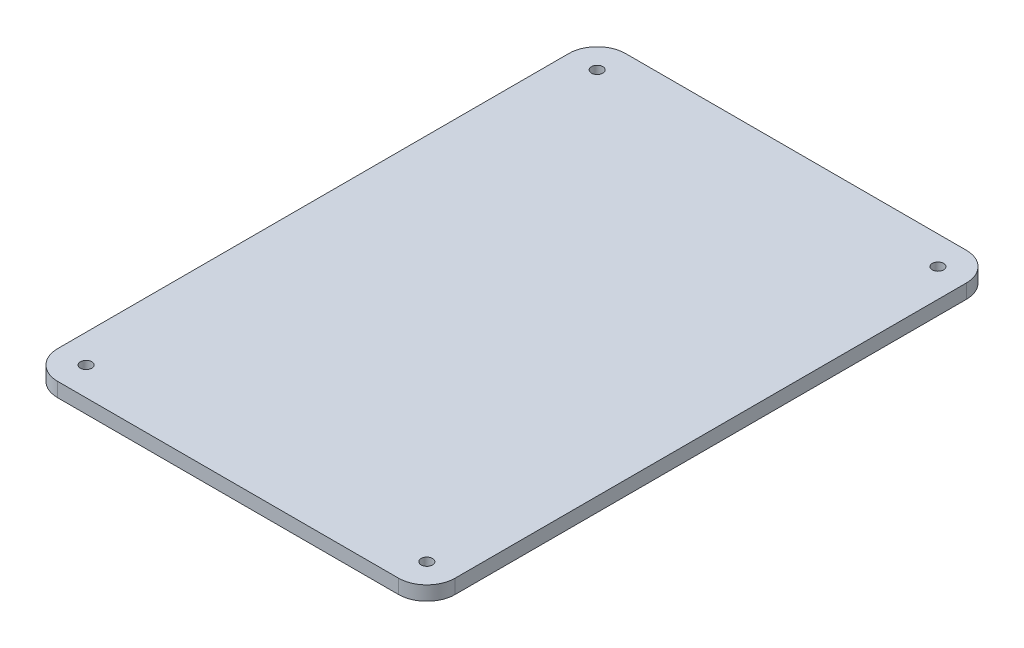
ISO-10303-21;
HEADER;
FILE_DESCRIPTION(('STEP AP214'),'2;1');
FILE_NAME('part.step','',(''),(''),'','','');
FILE_SCHEMA(('AUTOMOTIVE_DESIGN { 1 0 10303 214 1 1 1 1 }'));
ENDSEC;
DATA;
#1=APPLICATION_CONTEXT('core data for automotive mechanical design processes');
#2=APPLICATION_PROTOCOL_DEFINITION('international standard','automotive_design',2000,#1);
#3=PRODUCT_CONTEXT('',#1,'mechanical');
#4=PRODUCT('Part','Part','',(#3));
#5=PRODUCT_RELATED_PRODUCT_CATEGORY('part','',(#4));
#6=PRODUCT_DEFINITION_FORMATION('','',#4);
#7=PRODUCT_DEFINITION_CONTEXT('part definition',#1,'design');
#8=PRODUCT_DEFINITION('design','',#6,#7);
#9=PRODUCT_DEFINITION_SHAPE('','',#8);
#10=(LENGTH_UNIT() NAMED_UNIT(*) SI_UNIT(.MILLI.,.METRE.));
#11=(NAMED_UNIT(*) PLANE_ANGLE_UNIT() SI_UNIT($,.RADIAN.));
#12=(NAMED_UNIT(*) SI_UNIT($,.STERADIAN.) SOLID_ANGLE_UNIT());
#13=UNCERTAINTY_MEASURE_WITH_UNIT(LENGTH_MEASURE(1.E-05),#10,'distance_accuracy_value','');
#14=(GEOMETRIC_REPRESENTATION_CONTEXT(3) GLOBAL_UNCERTAINTY_ASSIGNED_CONTEXT((#13)) GLOBAL_UNIT_ASSIGNED_CONTEXT((#10,
#11,#12)) REPRESENTATION_CONTEXT('',''));
#15=CARTESIAN_POINT('',(0.,0.,0.));
#16=DIRECTION('',(0.,0.,1.));
#17=DIRECTION('',(1.,0.,0.));
#18=AXIS2_PLACEMENT_3D('',#15,#16,#17);
#19=CARTESIAN_POINT('',(0.,5.,0.));
#20=DIRECTION('',(0.,1.,0.));
#21=DIRECTION('',(0.,0.,1.));
#22=AXIS2_PLACEMENT_3D('',#19,#20,#21);
#23=PLANE('',#22);
#24=CARTESIAN_POINT('',(60.,5.,-90.));
#25=DIRECTION('',(0.,1.,0.));
#26=DIRECTION('',(0.,0.,1.));
#27=AXIS2_PLACEMENT_3D('',#24,#25,#26);
#28=CIRCLE('',#27,2.);
#29=CARTESIAN_POINT('',(60.,5.,-88.));
#30=VERTEX_POINT('',#29);
#31=EDGE_CURVE('E149',#30,#30,#28,.T.);
#32=ORIENTED_EDGE('',*,*,#31,.F.);
#33=EDGE_LOOP('',(#32));
#34=FACE_BOUND('',#33,.T.);
#35=CARTESIAN_POINT('',(-60.,5.,90.));
#36=DIRECTION('',(0.,1.,0.));
#37=DIRECTION('',(0.,0.,1.));
#38=AXIS2_PLACEMENT_3D('',#35,#36,#37);
#39=CIRCLE('',#38,2.);
#40=CARTESIAN_POINT('',(-60.,5.,92.));
#41=VERTEX_POINT('',#40);
#42=EDGE_CURVE('E154',#41,#41,#39,.T.);
#43=ORIENTED_EDGE('',*,*,#42,.F.);
#44=EDGE_LOOP('',(#43));
#45=FACE_BOUND('',#44,.T.);
#46=CARTESIAN_POINT('',(60.,5.,90.));
#47=DIRECTION('',(0.,1.,0.));
#48=DIRECTION('',(0.,0.,1.));
#49=AXIS2_PLACEMENT_3D('',#46,#47,#48);
#50=CIRCLE('',#49,2.);
#51=CARTESIAN_POINT('',(60.,5.,92.));
#52=VERTEX_POINT('',#51);
#53=EDGE_CURVE('E184',#52,#52,#50,.T.);
#54=ORIENTED_EDGE('',*,*,#53,.F.);
#55=EDGE_LOOP('',(#54));
#56=FACE_BOUND('',#55,.T.);
#57=CARTESIAN_POINT('',(-60.,5.,-90.));
#58=DIRECTION('',(0.,1.,0.));
#59=DIRECTION('',(0.,0.,1.));
#60=AXIS2_PLACEMENT_3D('',#57,#58,#59);
#61=CIRCLE('',#60,2.);
#62=CARTESIAN_POINT('',(-60.,5.,-88.));
#63=VERTEX_POINT('',#62);
#64=EDGE_CURVE('E187',#63,#63,#61,.T.);
#65=ORIENTED_EDGE('',*,*,#64,.F.);
#66=EDGE_LOOP('',(#65));
#67=FACE_BOUND('',#66,.T.);
#68=DIRECTION('',(0.,0.,1.));
#69=VECTOR('',#68,1.);
#70=CARTESIAN_POINT('',(-70.,5.,-92.5));
#71=LINE('',#70,#69);
#72=CARTESIAN_POINT('',(-70.,5.,-90.));
#73=VERTEX_POINT('',#72);
#74=CARTESIAN_POINT('',(-70.,5.,90.));
#75=VERTEX_POINT('',#74);
#76=EDGE_CURVE('E109',#73,#75,#71,.T.);
#77=ORIENTED_EDGE('',*,*,#76,.T.);
#78=CARTESIAN_POINT('',(-60.,5.,90.));
#79=DIRECTION('',(0.,1.,0.));
#80=DIRECTION('',(0.,0.,1.));
#81=AXIS2_PLACEMENT_3D('',#78,#79,#80);
#82=CIRCLE('',#81,10.);
#83=CARTESIAN_POINT('',(-60.,5.,100.));
#84=VERTEX_POINT('',#83);
#85=EDGE_CURVE('E168',#75,#84,#82,.T.);
#86=ORIENTED_EDGE('',*,*,#85,.T.);
#87=DIRECTION('',(1.,0.,0.));
#88=VECTOR('',#87,1.);
#89=CARTESIAN_POINT('',(-70.,5.,100.));
#90=LINE('',#89,#88);
#91=CARTESIAN_POINT('',(60.,5.,100.));
#92=VERTEX_POINT('',#91);
#93=EDGE_CURVE('E151',#84,#92,#90,.T.);
#94=ORIENTED_EDGE('',*,*,#93,.T.);
#95=CARTESIAN_POINT('',(60.,5.,90.));
#96=DIRECTION('',(0.,1.,0.));
#97=DIRECTION('',(0.,0.,1.));
#98=AXIS2_PLACEMENT_3D('',#95,#96,#97);
#99=CIRCLE('',#98,10.);
#100=CARTESIAN_POINT('',(70.,5.,90.));
#101=VERTEX_POINT('',#100);
#102=EDGE_CURVE('E166',#92,#101,#99,.T.);
#103=ORIENTED_EDGE('',*,*,#102,.T.);
#104=DIRECTION('',(0.,0.,-1.));
#105=VECTOR('',#104,1.);
#106=CARTESIAN_POINT('',(70.,5.,-100.));
#107=LINE('',#106,#105);
#108=CARTESIAN_POINT('',(70.,5.,-90.));
#109=VERTEX_POINT('',#108);
#110=EDGE_CURVE('E161',#101,#109,#107,.T.);
#111=ORIENTED_EDGE('',*,*,#110,.T.);
#112=CARTESIAN_POINT('',(60.,5.,-90.));
#113=DIRECTION('',(0.,1.,0.));
#114=DIRECTION('',(0.,0.,1.));
#115=AXIS2_PLACEMENT_3D('',#112,#113,#114);
#116=CIRCLE('',#115,10.);
#117=CARTESIAN_POINT('',(59.9999999999999,5.,-100.));
#118=VERTEX_POINT('',#117);
#119=EDGE_CURVE('E148',#109,#118,#116,.T.);
#120=ORIENTED_EDGE('',*,*,#119,.T.);
#121=DIRECTION('',(-1.,0.,0.));
#122=VECTOR('',#121,1.);
#123=CARTESIAN_POINT('',(-70.,5.,-100.));
#124=LINE('',#123,#122);
#125=CARTESIAN_POINT('',(-60.,5.,-100.));
#126=VERTEX_POINT('',#125);
#127=EDGE_CURVE('E143',#118,#126,#124,.T.);
#128=ORIENTED_EDGE('',*,*,#127,.T.);
#129=CARTESIAN_POINT('',(-60.,5.,-90.));
#130=DIRECTION('',(0.,1.,0.));
#131=DIRECTION('',(0.,0.,1.));
#132=AXIS2_PLACEMENT_3D('',#129,#130,#131);
#133=CIRCLE('',#132,10.);
#134=EDGE_CURVE('E146',#126,#73,#133,.T.);
#135=ORIENTED_EDGE('',*,*,#134,.T.);
#136=EDGE_LOOP('',(#77,#86,#94,#103,#111,#120,#128,#135));
#137=FACE_BOUND('',#136,.T.);
#138=ADVANCED_FACE('F35',(#34,#45,#56,#67,#137),#23,.T.);
#139=CARTESIAN_POINT('',(0.,0.,0.));
#140=DIRECTION('',(0.,1.,0.));
#141=DIRECTION('',(0.,0.,1.));
#142=AXIS2_PLACEMENT_3D('',#139,#140,#141);
#143=PLANE('',#142);
#144=CARTESIAN_POINT('',(60.,0.,-90.));
#145=DIRECTION('',(0.,1.,0.));
#146=DIRECTION('',(0.,0.,1.));
#147=AXIS2_PLACEMENT_3D('',#144,#145,#146);
#148=CIRCLE('',#147,2.);
#149=CARTESIAN_POINT('',(60.,0.,-88.));
#150=VERTEX_POINT('',#149);
#151=EDGE_CURVE('E193',#150,#150,#148,.T.);
#152=ORIENTED_EDGE('',*,*,#151,.T.);
#153=EDGE_LOOP('',(#152));
#154=FACE_BOUND('',#153,.T.);
#155=CARTESIAN_POINT('',(-60.,0.,90.));
#156=DIRECTION('',(0.,1.,0.));
#157=DIRECTION('',(0.,0.,1.));
#158=AXIS2_PLACEMENT_3D('',#155,#156,#157);
#159=CIRCLE('',#158,2.);
#160=CARTESIAN_POINT('',(-60.,0.,92.));
#161=VERTEX_POINT('',#160);
#162=EDGE_CURVE('E194',#161,#161,#159,.T.);
#163=ORIENTED_EDGE('',*,*,#162,.T.);
#164=EDGE_LOOP('',(#163));
#165=FACE_BOUND('',#164,.T.);
#166=CARTESIAN_POINT('',(60.,0.,90.));
#167=DIRECTION('',(0.,1.,0.));
#168=DIRECTION('',(0.,0.,1.));
#169=AXIS2_PLACEMENT_3D('',#166,#167,#168);
#170=CIRCLE('',#169,2.);
#171=CARTESIAN_POINT('',(60.,0.,92.));
#172=VERTEX_POINT('',#171);
#173=EDGE_CURVE('E197',#172,#172,#170,.T.);
#174=ORIENTED_EDGE('',*,*,#173,.T.);
#175=EDGE_LOOP('',(#174));
#176=FACE_BOUND('',#175,.T.);
#177=CARTESIAN_POINT('',(-60.,0.,-90.));
#178=DIRECTION('',(0.,1.,0.));
#179=DIRECTION('',(0.,0.,1.));
#180=AXIS2_PLACEMENT_3D('',#177,#178,#179);
#181=CIRCLE('',#180,2.);
#182=CARTESIAN_POINT('',(-60.,0.,-88.));
#183=VERTEX_POINT('',#182);
#184=EDGE_CURVE('E190',#183,#183,#181,.T.);
#185=ORIENTED_EDGE('',*,*,#184,.T.);
#186=EDGE_LOOP('',(#185));
#187=FACE_BOUND('',#186,.T.);
#188=DIRECTION('',(1.,0.,0.));
#189=VECTOR('',#188,1.);
#190=CARTESIAN_POINT('',(-70.,0.,100.));
#191=LINE('',#190,#189);
#192=CARTESIAN_POINT('',(-60.,0.,100.));
#193=VERTEX_POINT('',#192);
#194=CARTESIAN_POINT('',(60.,0.,100.));
#195=VERTEX_POINT('',#194);
#196=EDGE_CURVE('E121',#193,#195,#191,.T.);
#197=ORIENTED_EDGE('',*,*,#196,.F.);
#198=CARTESIAN_POINT('',(-60.,0.,90.));
#199=DIRECTION('',(0.,1.,0.));
#200=DIRECTION('',(0.,0.,1.));
#201=AXIS2_PLACEMENT_3D('',#198,#199,#200);
#202=CIRCLE('',#201,10.);
#203=CARTESIAN_POINT('',(-70.,0.,90.));
#204=VERTEX_POINT('',#203);
#205=EDGE_CURVE('E120',#193,#204,#202,.F.);
#206=ORIENTED_EDGE('',*,*,#205,.T.);
#207=DIRECTION('',(0.,0.,1.));
#208=VECTOR('',#207,1.);
#209=CARTESIAN_POINT('',(-70.,0.,-100.));
#210=LINE('',#209,#208);
#211=CARTESIAN_POINT('',(-70.,0.,-90.));
#212=VERTEX_POINT('',#211);
#213=EDGE_CURVE('E106',#212,#204,#210,.T.);
#214=ORIENTED_EDGE('',*,*,#213,.F.);
#215=CARTESIAN_POINT('',(-60.,0.,-90.));
#216=DIRECTION('',(0.,1.,0.));
#217=DIRECTION('',(0.,0.,1.));
#218=AXIS2_PLACEMENT_3D('',#215,#216,#217);
#219=CIRCLE('',#218,10.);
#220=CARTESIAN_POINT('',(-60.,0.,-100.));
#221=VERTEX_POINT('',#220);
#222=EDGE_CURVE('E117',#212,#221,#219,.F.);
#223=ORIENTED_EDGE('',*,*,#222,.T.);
#224=DIRECTION('',(-1.,0.,0.));
#225=VECTOR('',#224,1.);
#226=CARTESIAN_POINT('',(-70.,0.,-100.));
#227=LINE('',#226,#225);
#228=CARTESIAN_POINT('',(59.9999999999999,0.,-100.));
#229=VERTEX_POINT('',#228);
#230=EDGE_CURVE('E122',#229,#221,#227,.T.);
#231=ORIENTED_EDGE('',*,*,#230,.F.);
#232=CARTESIAN_POINT('',(60.,0.,-90.));
#233=DIRECTION('',(0.,1.,0.));
#234=DIRECTION('',(0.,0.,1.));
#235=AXIS2_PLACEMENT_3D('',#232,#233,#234);
#236=CIRCLE('',#235,10.);
#237=CARTESIAN_POINT('',(70.,0.,-90.));
#238=VERTEX_POINT('',#237);
#239=EDGE_CURVE('E50',#229,#238,#236,.F.);
#240=ORIENTED_EDGE('',*,*,#239,.T.);
#241=DIRECTION('',(0.,0.,-1.));
#242=VECTOR('',#241,1.);
#243=CARTESIAN_POINT('',(70.,0.,-100.));
#244=LINE('',#243,#242);
#245=CARTESIAN_POINT('',(70.,0.,90.));
#246=VERTEX_POINT('',#245);
#247=EDGE_CURVE('E113',#246,#238,#244,.T.);
#248=ORIENTED_EDGE('',*,*,#247,.F.);
#249=CARTESIAN_POINT('',(60.,0.,90.));
#250=DIRECTION('',(0.,1.,0.));
#251=DIRECTION('',(0.,0.,1.));
#252=AXIS2_PLACEMENT_3D('',#249,#250,#251);
#253=CIRCLE('',#252,10.);
#254=EDGE_CURVE('E128',#246,#195,#253,.F.);
#255=ORIENTED_EDGE('',*,*,#254,.T.);
#256=EDGE_LOOP('',(#197,#206,#214,#223,#231,#240,#248,#255));
#257=FACE_BOUND('',#256,.T.);
#258=ADVANCED_FACE('F116',(#154,#165,#176,#187,#257),#143,.F.);
#259=CARTESIAN_POINT('',(70.,0.,-100.));
#260=DIRECTION('',(1.,0.,0.));
#261=DIRECTION('',(0.,0.,-1.));
#262=AXIS2_PLACEMENT_3D('',#259,#260,#261);
#263=PLANE('',#262);
#264=ORIENTED_EDGE('',*,*,#110,.F.);
#265=DIRECTION('',(0.,1.,0.));
#266=VECTOR('',#265,1.);
#267=CARTESIAN_POINT('',(70.,0.,90.));
#268=LINE('',#267,#266);
#269=EDGE_CURVE('E57',#101,#246,#268,.F.);
#270=ORIENTED_EDGE('',*,*,#269,.T.);
#271=ORIENTED_EDGE('',*,*,#247,.T.);
#272=DIRECTION('',(0.,1.,0.));
#273=VECTOR('',#272,1.);
#274=CARTESIAN_POINT('',(70.,0.,-90.));
#275=LINE('',#274,#273);
#276=EDGE_CURVE('E136',#238,#109,#275,.T.);
#277=ORIENTED_EDGE('',*,*,#276,.T.);
#278=EDGE_LOOP('',(#264,#270,#271,#277));
#279=FACE_BOUND('',#278,.T.);
#280=ADVANCED_FACE('F227',(#279),#263,.T.);
#281=CARTESIAN_POINT('',(-70.,0.,100.));
#282=DIRECTION('',(0.,0.,1.));
#283=DIRECTION('',(1.,0.,0.));
#284=AXIS2_PLACEMENT_3D('',#281,#282,#283);
#285=PLANE('',#284);
#286=ORIENTED_EDGE('',*,*,#93,.F.);
#287=DIRECTION('',(0.,1.,0.));
#288=VECTOR('',#287,1.);
#289=CARTESIAN_POINT('',(-60.,0.,100.));
#290=LINE('',#289,#288);
#291=EDGE_CURVE('E126',#84,#193,#290,.F.);
#292=ORIENTED_EDGE('',*,*,#291,.T.);
#293=ORIENTED_EDGE('',*,*,#196,.T.);
#294=DIRECTION('',(0.,1.,0.));
#295=VECTOR('',#294,1.);
#296=CARTESIAN_POINT('',(60.,0.,100.));
#297=LINE('',#296,#295);
#298=EDGE_CURVE('E130',#195,#92,#297,.T.);
#299=ORIENTED_EDGE('',*,*,#298,.T.);
#300=EDGE_LOOP('',(#286,#292,#293,#299));
#301=FACE_BOUND('',#300,.T.);
#302=ADVANCED_FACE('F174',(#301),#285,.T.);
#303=CARTESIAN_POINT('',(-70.,0.,-92.5));
#304=DIRECTION('',(-1.,0.,0.));
#305=DIRECTION('',(0.,0.,1.));
#306=AXIS2_PLACEMENT_3D('',#303,#304,#305);
#307=PLANE('',#306);
#308=ORIENTED_EDGE('',*,*,#213,.T.);
#309=DIRECTION('',(0.,1.,0.));
#310=VECTOR('',#309,1.);
#311=CARTESIAN_POINT('',(-70.,0.,90.));
#312=LINE('',#311,#310);
#313=EDGE_CURVE('E112',#204,#75,#312,.T.);
#314=ORIENTED_EDGE('',*,*,#313,.T.);
#315=ORIENTED_EDGE('',*,*,#76,.F.);
#316=DIRECTION('',(0.,1.,0.));
#317=VECTOR('',#316,1.);
#318=CARTESIAN_POINT('',(-70.,0.,-90.));
#319=LINE('',#318,#317);
#320=EDGE_CURVE('E102',#73,#212,#319,.F.);
#321=ORIENTED_EDGE('',*,*,#320,.T.);
#322=EDGE_LOOP('',(#308,#314,#315,#321));
#323=FACE_BOUND('',#322,.T.);
#324=ADVANCED_FACE('F104',(#323),#307,.T.);
#325=CARTESIAN_POINT('',(-70.,0.,-100.));
#326=DIRECTION('',(0.,0.,-1.));
#327=DIRECTION('',(-1.,0.,0.));
#328=AXIS2_PLACEMENT_3D('',#325,#326,#327);
#329=PLANE('',#328);
#330=ORIENTED_EDGE('',*,*,#127,.F.);
#331=DIRECTION('',(0.,1.,0.));
#332=VECTOR('',#331,1.);
#333=CARTESIAN_POINT('',(59.9999999999999,0.,-100.));
#334=LINE('',#333,#332);
#335=EDGE_CURVE('E11',#118,#229,#334,.F.);
#336=ORIENTED_EDGE('',*,*,#335,.T.);
#337=ORIENTED_EDGE('',*,*,#230,.T.);
#338=DIRECTION('',(0.,1.,0.));
#339=VECTOR('',#338,1.);
#340=CARTESIAN_POINT('',(-60.,0.,-100.));
#341=LINE('',#340,#339);
#342=EDGE_CURVE('E43',#221,#126,#341,.T.);
#343=ORIENTED_EDGE('',*,*,#342,.T.);
#344=EDGE_LOOP('',(#330,#336,#337,#343));
#345=FACE_BOUND('',#344,.T.);
#346=ADVANCED_FACE('F142',(#345),#329,.T.);
#347=CARTESIAN_POINT('',(-60.,0.,90.));
#348=DIRECTION('',(0.,1.,0.));
#349=DIRECTION('',(0.,0.,1.));
#350=AXIS2_PLACEMENT_3D('',#347,#348,#349);
#351=CYLINDRICAL_SURFACE('',#350,10.);
#352=ORIENTED_EDGE('',*,*,#205,.F.);
#353=ORIENTED_EDGE('',*,*,#291,.F.);
#354=ORIENTED_EDGE('',*,*,#85,.F.);
#355=ORIENTED_EDGE('',*,*,#313,.F.);
#356=EDGE_LOOP('',(#352,#353,#354,#355));
#357=FACE_BOUND('',#356,.T.);
#358=ADVANCED_FACE('F179',(#357),#351,.T.);
#359=CARTESIAN_POINT('',(60.,0.,90.));
#360=DIRECTION('',(0.,1.,0.));
#361=DIRECTION('',(0.,0.,1.));
#362=AXIS2_PLACEMENT_3D('',#359,#360,#361);
#363=CYLINDRICAL_SURFACE('',#362,10.);
#364=ORIENTED_EDGE('',*,*,#254,.F.);
#365=ORIENTED_EDGE('',*,*,#269,.F.);
#366=ORIENTED_EDGE('',*,*,#102,.F.);
#367=ORIENTED_EDGE('',*,*,#298,.F.);
#368=EDGE_LOOP('',(#364,#365,#366,#367));
#369=FACE_BOUND('',#368,.T.);
#370=ADVANCED_FACE('F237',(#369),#363,.T.);
#371=CARTESIAN_POINT('',(60.,0.,-90.));
#372=DIRECTION('',(0.,1.,0.));
#373=DIRECTION('',(0.,0.,1.));
#374=AXIS2_PLACEMENT_3D('',#371,#372,#373);
#375=CYLINDRICAL_SURFACE('',#374,10.);
#376=ORIENTED_EDGE('',*,*,#239,.F.);
#377=ORIENTED_EDGE('',*,*,#335,.F.);
#378=ORIENTED_EDGE('',*,*,#119,.F.);
#379=ORIENTED_EDGE('',*,*,#276,.F.);
#380=EDGE_LOOP('',(#376,#377,#378,#379));
#381=FACE_BOUND('',#380,.T.);
#382=ADVANCED_FACE('F239',(#381),#375,.T.);
#383=CARTESIAN_POINT('',(-60.,0.,-90.));
#384=DIRECTION('',(0.,1.,0.));
#385=DIRECTION('',(0.,0.,1.));
#386=AXIS2_PLACEMENT_3D('',#383,#384,#385);
#387=CYLINDRICAL_SURFACE('',#386,10.);
#388=ORIENTED_EDGE('',*,*,#222,.F.);
#389=ORIENTED_EDGE('',*,*,#320,.F.);
#390=ORIENTED_EDGE('',*,*,#134,.F.);
#391=ORIENTED_EDGE('',*,*,#342,.F.);
#392=EDGE_LOOP('',(#388,#389,#390,#391));
#393=FACE_BOUND('',#392,.T.);
#394=ADVANCED_FACE('F37',(#393),#387,.T.);
#395=CARTESIAN_POINT('',(-60.,0.,-90.));
#396=DIRECTION('',(0.,1.,0.));
#397=DIRECTION('',(0.,0.,1.));
#398=AXIS2_PLACEMENT_3D('',#395,#396,#397);
#399=CYLINDRICAL_SURFACE('',#398,2.);
#400=ORIENTED_EDGE('',*,*,#64,.T.);
#401=EDGE_LOOP('',(#400));
#402=FACE_BOUND('',#401,.T.);
#403=ORIENTED_EDGE('',*,*,#184,.F.);
#404=EDGE_LOOP('',(#403));
#405=FACE_BOUND('',#404,.T.);
#406=ADVANCED_FACE('F208',(#402,#405),#399,.F.);
#407=CARTESIAN_POINT('',(60.,0.,90.));
#408=DIRECTION('',(0.,1.,0.));
#409=DIRECTION('',(0.,0.,1.));
#410=AXIS2_PLACEMENT_3D('',#407,#408,#409);
#411=CYLINDRICAL_SURFACE('',#410,2.);
#412=ORIENTED_EDGE('',*,*,#53,.T.);
#413=EDGE_LOOP('',(#412));
#414=FACE_BOUND('',#413,.T.);
#415=ORIENTED_EDGE('',*,*,#173,.F.);
#416=EDGE_LOOP('',(#415));
#417=FACE_BOUND('',#416,.T.);
#418=ADVANCED_FACE('F205',(#414,#417),#411,.F.);
#419=CARTESIAN_POINT('',(-60.,0.,90.));
#420=DIRECTION('',(0.,1.,0.));
#421=DIRECTION('',(0.,0.,1.));
#422=AXIS2_PLACEMENT_3D('',#419,#420,#421);
#423=CYLINDRICAL_SURFACE('',#422,2.);
#424=ORIENTED_EDGE('',*,*,#42,.T.);
#425=EDGE_LOOP('',(#424));
#426=FACE_BOUND('',#425,.T.);
#427=ORIENTED_EDGE('',*,*,#162,.F.);
#428=EDGE_LOOP('',(#427));
#429=FACE_BOUND('',#428,.T.);
#430=ADVANCED_FACE('F207',(#426,#429),#423,.F.);
#431=CARTESIAN_POINT('',(60.,0.,-90.));
#432=DIRECTION('',(0.,1.,0.));
#433=DIRECTION('',(0.,0.,1.));
#434=AXIS2_PLACEMENT_3D('',#431,#432,#433);
#435=CYLINDRICAL_SURFACE('',#434,2.);
#436=ORIENTED_EDGE('',*,*,#31,.T.);
#437=EDGE_LOOP('',(#436));
#438=FACE_BOUND('',#437,.T.);
#439=ORIENTED_EDGE('',*,*,#151,.F.);
#440=EDGE_LOOP('',(#439));
#441=FACE_BOUND('',#440,.T.);
#442=ADVANCED_FACE('F215',(#438,#441),#435,.F.);
#443=CLOSED_SHELL('',(#138,#258,#280,#302,#324,#346,#358,#370,#382,#394,#406,#418,#430,#442));
#444=MANIFOLD_SOLID_BREP('B2',#443);
#445=ADVANCED_BREP_SHAPE_REPRESENTATION('',(#18,#444),#14);
#446=SHAPE_DEFINITION_REPRESENTATION(#9,#445);
ENDSEC;
END-ISO-10303-21;
